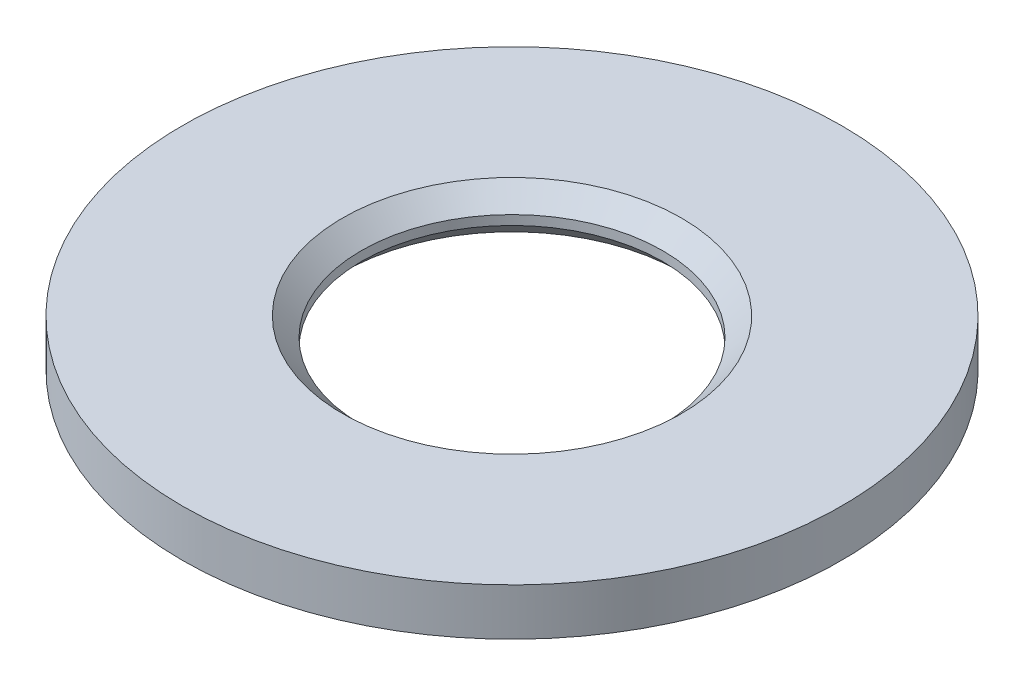
ISO-10303-21;
HEADER;
FILE_DESCRIPTION(('STEP AP214'),'2;1');
FILE_NAME('part.step','',(''),(''),'','','');
FILE_SCHEMA(('AUTOMOTIVE_DESIGN { 1 0 10303 214 1 1 1 1 }'));
ENDSEC;
DATA;
#1=APPLICATION_CONTEXT('core data for automotive mechanical design processes');
#2=APPLICATION_PROTOCOL_DEFINITION('international standard','automotive_design',2000,#1);
#3=PRODUCT_CONTEXT('',#1,'mechanical');
#4=PRODUCT('Part','Part','',(#3));
#5=PRODUCT_RELATED_PRODUCT_CATEGORY('part','',(#4));
#6=PRODUCT_DEFINITION_FORMATION('','',#4);
#7=PRODUCT_DEFINITION_CONTEXT('part definition',#1,'design');
#8=PRODUCT_DEFINITION('design','',#6,#7);
#9=PRODUCT_DEFINITION_SHAPE('','',#8);
#10=(LENGTH_UNIT() NAMED_UNIT(*) SI_UNIT(.MILLI.,.METRE.));
#11=(NAMED_UNIT(*) PLANE_ANGLE_UNIT() SI_UNIT($,.RADIAN.));
#12=(NAMED_UNIT(*) SI_UNIT($,.STERADIAN.) SOLID_ANGLE_UNIT());
#13=UNCERTAINTY_MEASURE_WITH_UNIT(LENGTH_MEASURE(1.E-05),#10,'distance_accuracy_value','');
#14=(GEOMETRIC_REPRESENTATION_CONTEXT(3) GLOBAL_UNCERTAINTY_ASSIGNED_CONTEXT((#13)) GLOBAL_UNIT_ASSIGNED_CONTEXT((#10,
#11,#12)) REPRESENTATION_CONTEXT('',''));
#15=CARTESIAN_POINT('',(0.,0.,0.));
#16=DIRECTION('',(0.,0.,1.));
#17=DIRECTION('',(1.,0.,0.));
#18=AXIS2_PLACEMENT_3D('',#15,#16,#17);
#19=CARTESIAN_POINT('',(0.,0.2,0.));
#20=DIRECTION('',(0.,-1.,0.));
#21=DIRECTION('',(0.,0.,-1.));
#22=AXIS2_PLACEMENT_3D('',#19,#20,#21);
#23=CONICAL_SURFACE('',#22,1.6,0.785398163397448);
#24=CARTESIAN_POINT('',(0.,0.,0.));
#25=DIRECTION('',(0.,-1.,0.));
#26=DIRECTION('',(0.,0.,-1.));
#27=AXIS2_PLACEMENT_3D('',#24,#25,#26);
#28=CIRCLE('',#27,1.8);
#29=CARTESIAN_POINT('',(0.,0.,-1.8));
#30=VERTEX_POINT('',#29);
#31=EDGE_CURVE('E8',#30,#30,#28,.T.);
#32=ORIENTED_EDGE('',*,*,#31,.T.);
#33=EDGE_LOOP('',(#32));
#34=FACE_BOUND('',#33,.T.);
#35=CARTESIAN_POINT('',(0.,0.2,0.));
#36=DIRECTION('',(0.,-1.,0.));
#37=DIRECTION('',(0.,0.,-1.));
#38=AXIS2_PLACEMENT_3D('',#35,#36,#37);
#39=CIRCLE('',#38,1.6);
#40=CARTESIAN_POINT('',(0.,0.2,-1.6));
#41=VERTEX_POINT('',#40);
#42=EDGE_CURVE('E47',#41,#41,#39,.T.);
#43=ORIENTED_EDGE('',*,*,#42,.F.);
#44=EDGE_LOOP('',(#43));
#45=FACE_BOUND('',#44,.T.);
#46=ADVANCED_FACE('F13',(#34,#45),#23,.F.);
#47=CARTESIAN_POINT('',(1.8,0.,0.));
#48=DIRECTION('',(0.,-1.,0.));
#49=DIRECTION('',(0.,0.,-1.));
#50=AXIS2_PLACEMENT_3D('',#47,#48,#49);
#51=PLANE('',#50);
#52=CARTESIAN_POINT('',(0.,0.,0.));
#53=DIRECTION('',(0.,-1.,0.));
#54=DIRECTION('',(0.,0.,-1.));
#55=AXIS2_PLACEMENT_3D('',#52,#53,#54);
#56=CIRCLE('',#55,3.5);
#57=CARTESIAN_POINT('',(0.,0.,-3.5));
#58=VERTEX_POINT('',#57);
#59=EDGE_CURVE('E20',#58,#58,#56,.T.);
#60=ORIENTED_EDGE('',*,*,#59,.T.);
#61=EDGE_LOOP('',(#60));
#62=FACE_BOUND('',#61,.T.);
#63=ORIENTED_EDGE('',*,*,#31,.F.);
#64=EDGE_LOOP('',(#63));
#65=FACE_BOUND('',#64,.T.);
#66=ADVANCED_FACE('F56',(#62,#65),#51,.T.);
#67=CARTESIAN_POINT('',(0.,0.,0.));
#68=DIRECTION('',(0.,-1.,0.));
#69=DIRECTION('',(0.,0.,-1.));
#70=AXIS2_PLACEMENT_3D('',#67,#68,#69);
#71=CYLINDRICAL_SURFACE('',#70,3.5);
#72=CARTESIAN_POINT('',(0.,0.5,0.));
#73=DIRECTION('',(0.,-1.,0.));
#74=DIRECTION('',(0.,0.,-1.));
#75=AXIS2_PLACEMENT_3D('',#72,#73,#74);
#76=CIRCLE('',#75,3.5);
#77=CARTESIAN_POINT('',(0.,0.5,-3.5));
#78=VERTEX_POINT('',#77);
#79=EDGE_CURVE('E29',#78,#78,#76,.T.);
#80=ORIENTED_EDGE('',*,*,#79,.T.);
#81=EDGE_LOOP('',(#80));
#82=FACE_BOUND('',#81,.T.);
#83=ORIENTED_EDGE('',*,*,#59,.F.);
#84=EDGE_LOOP('',(#83));
#85=FACE_BOUND('',#84,.T.);
#86=ADVANCED_FACE('F61',(#82,#85),#71,.T.);
#87=CARTESIAN_POINT('',(3.5,0.5,0.));
#88=DIRECTION('',(0.,1.,0.));
#89=DIRECTION('',(0.,0.,1.));
#90=AXIS2_PLACEMENT_3D('',#87,#88,#89);
#91=PLANE('',#90);
#92=CARTESIAN_POINT('',(0.,0.5,0.));
#93=DIRECTION('',(0.,-1.,0.));
#94=DIRECTION('',(0.,0.,-1.));
#95=AXIS2_PLACEMENT_3D('',#92,#93,#94);
#96=CIRCLE('',#95,1.8);
#97=CARTESIAN_POINT('',(0.,0.5,-1.8));
#98=VERTEX_POINT('',#97);
#99=EDGE_CURVE('E37',#98,#98,#96,.T.);
#100=ORIENTED_EDGE('',*,*,#99,.T.);
#101=EDGE_LOOP('',(#100));
#102=FACE_BOUND('',#101,.T.);
#103=ORIENTED_EDGE('',*,*,#79,.F.);
#104=EDGE_LOOP('',(#103));
#105=FACE_BOUND('',#104,.T.);
#106=ADVANCED_FACE('F65',(#102,#105),#91,.T.);
#107=CARTESIAN_POINT('',(0.,0.5,0.));
#108=DIRECTION('',(0.,1.,0.));
#109=DIRECTION('',(0.,0.,1.));
#110=AXIS2_PLACEMENT_3D('',#107,#108,#109);
#111=CONICAL_SURFACE('',#110,1.8,0.785398163397448);
#112=CARTESIAN_POINT('',(0.,0.3,0.));
#113=DIRECTION('',(0.,-1.,0.));
#114=DIRECTION('',(0.,0.,-1.));
#115=AXIS2_PLACEMENT_3D('',#112,#113,#114);
#116=CIRCLE('',#115,1.6);
#117=CARTESIAN_POINT('',(0.,0.3,-1.6));
#118=VERTEX_POINT('',#117);
#119=EDGE_CURVE('E43',#118,#118,#116,.T.);
#120=ORIENTED_EDGE('',*,*,#119,.T.);
#121=EDGE_LOOP('',(#120));
#122=FACE_BOUND('',#121,.T.);
#123=ORIENTED_EDGE('',*,*,#99,.F.);
#124=EDGE_LOOP('',(#123));
#125=FACE_BOUND('',#124,.T.);
#126=ADVANCED_FACE('F72',(#122,#125),#111,.F.);
#127=CARTESIAN_POINT('',(0.,0.,0.));
#128=DIRECTION('',(0.,-1.,0.));
#129=DIRECTION('',(0.,0.,-1.));
#130=AXIS2_PLACEMENT_3D('',#127,#128,#129);
#131=CYLINDRICAL_SURFACE('',#130,1.6);
#132=ORIENTED_EDGE('',*,*,#42,.T.);
#133=EDGE_LOOP('',(#132));
#134=FACE_BOUND('',#133,.T.);
#135=ORIENTED_EDGE('',*,*,#119,.F.);
#136=EDGE_LOOP('',(#135));
#137=FACE_BOUND('',#136,.T.);
#138=ADVANCED_FACE('F52',(#134,#137),#131,.F.);
#139=CLOSED_SHELL('',(#46,#66,#86,#106,#126,#138));
#140=MANIFOLD_SOLID_BREP('B1',#139);
#141=ADVANCED_BREP_SHAPE_REPRESENTATION('',(#18,#140),#14);
#142=SHAPE_DEFINITION_REPRESENTATION(#9,#141);
ENDSEC;
END-ISO-10303-21;
